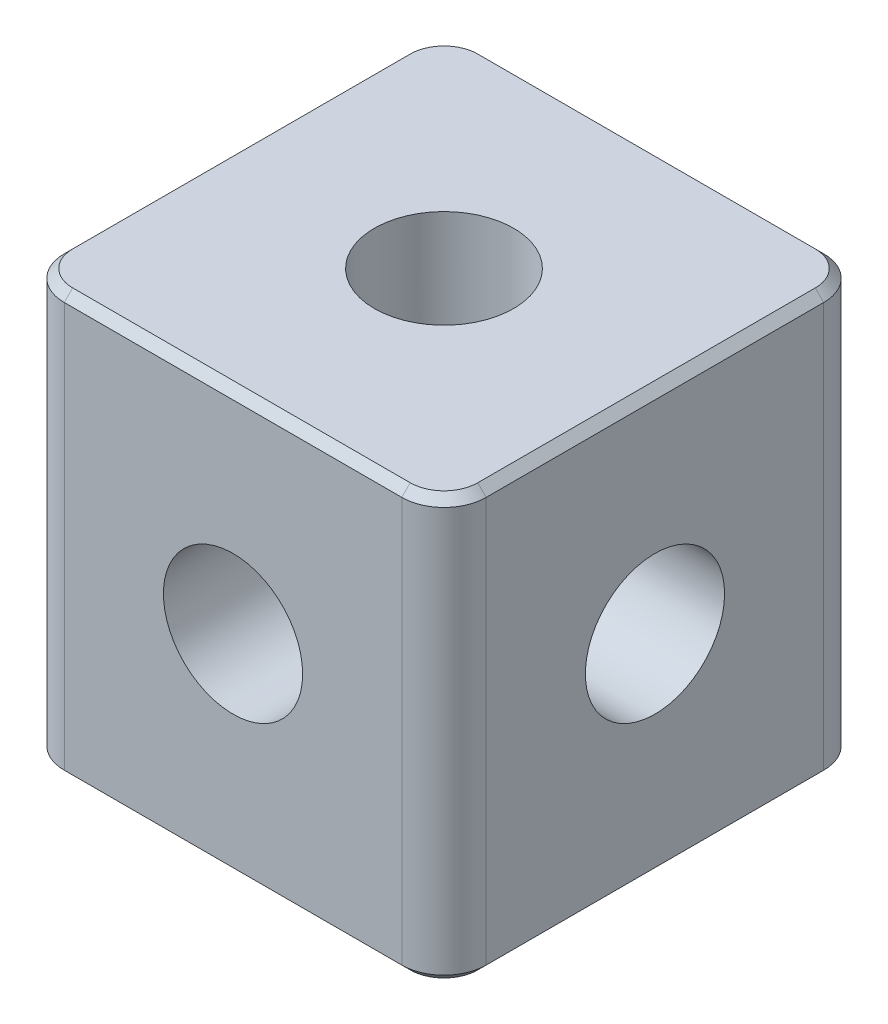
ISO-10303-21;
HEADER;
FILE_DESCRIPTION(('STEP AP214'),'2;1');
FILE_NAME('part.step','',(''),(''),'','','');
FILE_SCHEMA(('AUTOMOTIVE_DESIGN { 1 0 10303 214 1 1 1 1 }'));
ENDSEC;
DATA;
#1=APPLICATION_CONTEXT('core data for automotive mechanical design processes');
#2=APPLICATION_PROTOCOL_DEFINITION('international standard','automotive_design',2000,#1);
#3=PRODUCT_CONTEXT('',#1,'mechanical');
#4=PRODUCT('Part','Part','',(#3));
#5=PRODUCT_RELATED_PRODUCT_CATEGORY('part','',(#4));
#6=PRODUCT_DEFINITION_FORMATION('','',#4);
#7=PRODUCT_DEFINITION_CONTEXT('part definition',#1,'design');
#8=PRODUCT_DEFINITION('design','',#6,#7);
#9=PRODUCT_DEFINITION_SHAPE('','',#8);
#10=(LENGTH_UNIT() NAMED_UNIT(*) SI_UNIT(.MILLI.,.METRE.));
#11=(NAMED_UNIT(*) PLANE_ANGLE_UNIT() SI_UNIT($,.RADIAN.));
#12=(NAMED_UNIT(*) SI_UNIT($,.STERADIAN.) SOLID_ANGLE_UNIT());
#13=UNCERTAINTY_MEASURE_WITH_UNIT(LENGTH_MEASURE(1.E-05),#10,'distance_accuracy_value','');
#14=(GEOMETRIC_REPRESENTATION_CONTEXT(3) GLOBAL_UNCERTAINTY_ASSIGNED_CONTEXT((#13)) GLOBAL_UNIT_ASSIGNED_CONTEXT((#10,
#11,#12)) REPRESENTATION_CONTEXT('',''));
#15=CARTESIAN_POINT('',(0.,0.,0.));
#16=DIRECTION('',(0.,0.,1.));
#17=DIRECTION('',(1.,0.,0.));
#18=AXIS2_PLACEMENT_3D('',#15,#16,#17);
#19=CARTESIAN_POINT('',(0.,5.,0.));
#20=DIRECTION('',(0.,1.,0.));
#21=DIRECTION('',(0.,0.,1.));
#22=AXIS2_PLACEMENT_3D('',#19,#20,#21);
#23=CYLINDRICAL_SURFACE('',#22,1.65);
#24=CARTESIAN_POINT('',(0.,5.,0.));
#25=DIRECTION('',(0.,1.,0.));
#26=DIRECTION('',(0.,0.,1.));
#27=AXIS2_PLACEMENT_3D('',#24,#25,#26);
#28=CIRCLE('',#27,1.65);
#29=CARTESIAN_POINT('',(0.,5.,1.65));
#30=VERTEX_POINT('',#29);
#31=EDGE_CURVE('E491',#30,#30,#28,.T.);
#32=ORIENTED_EDGE('',*,*,#31,.T.);
#33=EDGE_LOOP('',(#32));
#34=FACE_BOUND('',#33,.T.);
#35=CARTESIAN_POINT('',(0.,0.,0.));
#36=DIRECTION('',(0.,0.707106781186547,-0.707106781186547));
#37=DIRECTION('',(0.,0.707106781186547,0.707106781186547));
#38=AXIS2_PLACEMENT_3D('',#35,#36,#37);
#39=ELLIPSE('',#38,2.3334523779156,1.65);
#40=CARTESIAN_POINT('',(1.1667261889578,1.1667261889578,1.1667261889578));
#41=VERTEX_POINT('',#40);
#42=CARTESIAN_POINT('',(-1.1667261889578,1.1667261889578,1.1667261889578));
#43=VERTEX_POINT('',#42);
#44=EDGE_CURVE('E212',#41,#43,#39,.F.);
#45=ORIENTED_EDGE('',*,*,#44,.T.);
#46=CARTESIAN_POINT('',(0.,0.,0.));
#47=DIRECTION('',(0.707106781186547,0.707106781186547,0.));
#48=DIRECTION('',(-0.707106781186547,0.707106781186547,0.));
#49=AXIS2_PLACEMENT_3D('',#46,#47,#48);
#50=ELLIPSE('',#49,2.3334523779156,1.65);
#51=CARTESIAN_POINT('',(-1.1667261889578,1.1667261889578,-1.1667261889578));
#52=VERTEX_POINT('',#51);
#53=EDGE_CURVE('E517',#43,#52,#50,.F.);
#54=ORIENTED_EDGE('',*,*,#53,.T.);
#55=CARTESIAN_POINT('',(0.,0.,0.));
#56=DIRECTION('',(0.,0.707106781186547,0.707106781186547));
#57=DIRECTION('',(0.,0.707106781186547,-0.707106781186547));
#58=AXIS2_PLACEMENT_3D('',#55,#56,#57);
#59=ELLIPSE('',#58,2.3334523779156,1.65);
#60=CARTESIAN_POINT('',(1.1667261889578,1.1667261889578,-1.1667261889578));
#61=VERTEX_POINT('',#60);
#62=EDGE_CURVE('E195',#52,#61,#59,.F.);
#63=ORIENTED_EDGE('',*,*,#62,.T.);
#64=CARTESIAN_POINT('',(0.,0.,0.));
#65=DIRECTION('',(-0.707106781186547,0.707106781186547,0.));
#66=DIRECTION('',(0.707106781186547,0.707106781186547,0.));
#67=AXIS2_PLACEMENT_3D('',#64,#65,#66);
#68=ELLIPSE('',#67,2.3334523779156,1.65);
#69=EDGE_CURVE('E506',#61,#41,#68,.F.);
#70=ORIENTED_EDGE('',*,*,#69,.T.);
#71=EDGE_LOOP('',(#45,#54,#63,#70));
#72=FACE_BOUND('',#71,.T.);
#73=ADVANCED_FACE('F41',(#34,#72),#23,.F.);
#74=CARTESIAN_POINT('',(5.,5.,5.));
#75=DIRECTION('',(-1.,0.,0.));
#76=DIRECTION('',(0.,0.,1.));
#77=AXIS2_PLACEMENT_3D('',#74,#75,#76);
#78=PLANE('',#77);
#79=CARTESIAN_POINT('',(5.,0.,0.));
#80=DIRECTION('',(1.,0.,0.));
#81=DIRECTION('',(0.,0.,-1.));
#82=AXIS2_PLACEMENT_3D('',#79,#80,#81);
#83=CIRCLE('',#82,1.65);
#84=CARTESIAN_POINT('',(5.,0.,-1.65));
#85=VERTEX_POINT('',#84);
#86=EDGE_CURVE('E382',#85,#85,#83,.T.);
#87=ORIENTED_EDGE('',*,*,#86,.F.);
#88=EDGE_LOOP('',(#87));
#89=FACE_BOUND('',#88,.T.);
#90=DIRECTION('',(0.,-1.,0.));
#91=VECTOR('',#90,1.);
#92=CARTESIAN_POINT('',(5.,5.,4.));
#93=LINE('',#92,#91);
#94=CARTESIAN_POINT('',(5.,4.8,4.));
#95=VERTEX_POINT('',#94);
#96=CARTESIAN_POINT('',(5.,-4.8,4.));
#97=VERTEX_POINT('',#96);
#98=EDGE_CURVE('E234',#95,#97,#93,.T.);
#99=ORIENTED_EDGE('',*,*,#98,.T.);
#100=DIRECTION('',(0.,0.,-1.));
#101=VECTOR('',#100,1.);
#102=CARTESIAN_POINT('',(5.,-4.8,-4.));
#103=LINE('',#102,#101);
#104=CARTESIAN_POINT('',(5.,-4.8,-4.));
#105=VERTEX_POINT('',#104);
#106=EDGE_CURVE('E262',#97,#105,#103,.T.);
#107=ORIENTED_EDGE('',*,*,#106,.T.);
#108=DIRECTION('',(0.,-1.,0.));
#109=VECTOR('',#108,1.);
#110=CARTESIAN_POINT('',(5.,5.,-4.));
#111=LINE('',#110,#109);
#112=CARTESIAN_POINT('',(5.,4.8,-4.));
#113=VERTEX_POINT('',#112);
#114=EDGE_CURVE('E238',#105,#113,#111,.F.);
#115=ORIENTED_EDGE('',*,*,#114,.T.);
#116=DIRECTION('',(0.,0.,1.));
#117=VECTOR('',#116,1.);
#118=CARTESIAN_POINT('',(5.,4.8,5.));
#119=LINE('',#118,#117);
#120=EDGE_CURVE('E258',#113,#95,#119,.T.);
#121=ORIENTED_EDGE('',*,*,#120,.T.);
#122=EDGE_LOOP('',(#99,#107,#115,#121));
#123=FACE_BOUND('',#122,.T.);
#124=ADVANCED_FACE('F476',(#89,#123),#78,.F.);
#125=CARTESIAN_POINT('',(-5.,5.,-5.));
#126=DIRECTION('',(0.,0.,1.));
#127=DIRECTION('',(1.,0.,0.));
#128=AXIS2_PLACEMENT_3D('',#125,#126,#127);
#129=PLANE('',#128);
#130=CARTESIAN_POINT('',(0.,0.,-5.));
#131=DIRECTION('',(0.,0.,1.));
#132=DIRECTION('',(1.,0.,0.));
#133=AXIS2_PLACEMENT_3D('',#130,#131,#132);
#134=CIRCLE('',#133,1.65);
#135=CARTESIAN_POINT('',(1.65,0.,-5.));
#136=VERTEX_POINT('',#135);
#137=EDGE_CURVE('E494',#136,#136,#134,.T.);
#138=ORIENTED_EDGE('',*,*,#137,.T.);
#139=EDGE_LOOP('',(#138));
#140=FACE_BOUND('',#139,.T.);
#141=DIRECTION('',(0.,-1.,0.));
#142=VECTOR('',#141,1.);
#143=CARTESIAN_POINT('',(4.,5.,-5.));
#144=LINE('',#143,#142);
#145=CARTESIAN_POINT('',(4.,4.8,-5.));
#146=VERTEX_POINT('',#145);
#147=CARTESIAN_POINT('',(4.,-4.8,-5.));
#148=VERTEX_POINT('',#147);
#149=EDGE_CURVE('E230',#146,#148,#144,.T.);
#150=ORIENTED_EDGE('',*,*,#149,.T.);
#151=DIRECTION('',(-1.,0.,0.));
#152=VECTOR('',#151,1.);
#153=CARTESIAN_POINT('',(-4.,-4.8,-5.));
#154=LINE('',#153,#152);
#155=CARTESIAN_POINT('',(-4.,-4.8,-5.));
#156=VERTEX_POINT('',#155);
#157=EDGE_CURVE('E306',#148,#156,#154,.T.);
#158=ORIENTED_EDGE('',*,*,#157,.T.);
#159=DIRECTION('',(0.,-1.,0.));
#160=VECTOR('',#159,1.);
#161=CARTESIAN_POINT('',(-4.,5.,-5.));
#162=LINE('',#161,#160);
#163=CARTESIAN_POINT('',(-4.,4.8,-5.));
#164=VERTEX_POINT('',#163);
#165=EDGE_CURVE('E226',#156,#164,#162,.F.);
#166=ORIENTED_EDGE('',*,*,#165,.T.);
#167=DIRECTION('',(1.,0.,0.));
#168=VECTOR('',#167,1.);
#169=CARTESIAN_POINT('',(-5.,4.8,-5.));
#170=LINE('',#169,#168);
#171=EDGE_CURVE('E303',#164,#146,#170,.T.);
#172=ORIENTED_EDGE('',*,*,#171,.T.);
#173=EDGE_LOOP('',(#150,#158,#166,#172));
#174=FACE_BOUND('',#173,.T.);
#175=ADVANCED_FACE('F533',(#140,#174),#129,.F.);
#176=CARTESIAN_POINT('',(-5.,5.,5.));
#177=DIRECTION('',(1.,0.,0.));
#178=DIRECTION('',(0.,0.,-1.));
#179=AXIS2_PLACEMENT_3D('',#176,#177,#178);
#180=PLANE('',#179);
#181=CARTESIAN_POINT('',(-5.,0.,0.));
#182=DIRECTION('',(1.,0.,0.));
#183=DIRECTION('',(0.,0.,-1.));
#184=AXIS2_PLACEMENT_3D('',#181,#182,#183);
#185=CIRCLE('',#184,1.65);
#186=CARTESIAN_POINT('',(-5.,0.,-1.65));
#187=VERTEX_POINT('',#186);
#188=EDGE_CURVE('E205',#187,#187,#185,.T.);
#189=ORIENTED_EDGE('',*,*,#188,.T.);
#190=EDGE_LOOP('',(#189));
#191=FACE_BOUND('',#190,.T.);
#192=DIRECTION('',(0.,-1.,0.));
#193=VECTOR('',#192,1.);
#194=CARTESIAN_POINT('',(-5.,5.,-4.));
#195=LINE('',#194,#193);
#196=CARTESIAN_POINT('',(-5.,4.8,-4.));
#197=VERTEX_POINT('',#196);
#198=CARTESIAN_POINT('',(-5.,-4.8,-4.));
#199=VERTEX_POINT('',#198);
#200=EDGE_CURVE('E250',#197,#199,#195,.T.);
#201=ORIENTED_EDGE('',*,*,#200,.T.);
#202=DIRECTION('',(0.,0.,1.));
#203=VECTOR('',#202,1.);
#204=CARTESIAN_POINT('',(-5.,-4.8,4.));
#205=LINE('',#204,#203);
#206=CARTESIAN_POINT('',(-5.,-4.8,4.));
#207=VERTEX_POINT('',#206);
#208=EDGE_CURVE('E330',#199,#207,#205,.T.);
#209=ORIENTED_EDGE('',*,*,#208,.T.);
#210=DIRECTION('',(0.,-1.,0.));
#211=VECTOR('',#210,1.);
#212=CARTESIAN_POINT('',(-5.,5.,4.));
#213=LINE('',#212,#211);
#214=CARTESIAN_POINT('',(-5.,4.8,4.));
#215=VERTEX_POINT('',#214);
#216=EDGE_CURVE('E254',#207,#215,#213,.F.);
#217=ORIENTED_EDGE('',*,*,#216,.T.);
#218=DIRECTION('',(0.,0.,-1.));
#219=VECTOR('',#218,1.);
#220=CARTESIAN_POINT('',(-5.,4.8,5.));
#221=LINE('',#220,#219);
#222=EDGE_CURVE('E327',#215,#197,#221,.T.);
#223=ORIENTED_EDGE('',*,*,#222,.T.);
#224=EDGE_LOOP('',(#201,#209,#217,#223));
#225=FACE_BOUND('',#224,.T.);
#226=ADVANCED_FACE('F423',(#191,#225),#180,.F.);
#227=CARTESIAN_POINT('',(-5.,5.,5.));
#228=DIRECTION('',(0.,0.,-1.));
#229=DIRECTION('',(-1.,0.,0.));
#230=AXIS2_PLACEMENT_3D('',#227,#228,#229);
#231=PLANE('',#230);
#232=CARTESIAN_POINT('',(0.,0.,5.));
#233=DIRECTION('',(0.,0.,1.));
#234=DIRECTION('',(1.,0.,0.));
#235=AXIS2_PLACEMENT_3D('',#232,#233,#234);
#236=CIRCLE('',#235,1.65);
#237=CARTESIAN_POINT('',(1.65,0.,5.));
#238=VERTEX_POINT('',#237);
#239=EDGE_CURVE('E500',#238,#238,#236,.T.);
#240=ORIENTED_EDGE('',*,*,#239,.F.);
#241=EDGE_LOOP('',(#240));
#242=FACE_BOUND('',#241,.T.);
#243=DIRECTION('',(0.,-1.,0.));
#244=VECTOR('',#243,1.);
#245=CARTESIAN_POINT('',(-4.,5.,5.));
#246=LINE('',#245,#244);
#247=CARTESIAN_POINT('',(-4.,4.8,5.));
#248=VERTEX_POINT('',#247);
#249=CARTESIAN_POINT('',(-4.,-4.8,5.));
#250=VERTEX_POINT('',#249);
#251=EDGE_CURVE('E242',#248,#250,#246,.T.);
#252=ORIENTED_EDGE('',*,*,#251,.T.);
#253=DIRECTION('',(1.,0.,0.));
#254=VECTOR('',#253,1.);
#255=CARTESIAN_POINT('',(4.,-4.8,5.));
#256=LINE('',#255,#254);
#257=CARTESIAN_POINT('',(4.,-4.8,5.));
#258=VERTEX_POINT('',#257);
#259=EDGE_CURVE('E312',#250,#258,#256,.T.);
#260=ORIENTED_EDGE('',*,*,#259,.T.);
#261=DIRECTION('',(0.,-1.,0.));
#262=VECTOR('',#261,1.);
#263=CARTESIAN_POINT('',(4.,5.,5.));
#264=LINE('',#263,#262);
#265=CARTESIAN_POINT('',(4.,4.8,5.));
#266=VERTEX_POINT('',#265);
#267=EDGE_CURVE('E246',#258,#266,#264,.F.);
#268=ORIENTED_EDGE('',*,*,#267,.T.);
#269=DIRECTION('',(-1.,0.,0.));
#270=VECTOR('',#269,1.);
#271=CARTESIAN_POINT('',(-5.,4.8,5.));
#272=LINE('',#271,#270);
#273=EDGE_CURVE('E309',#266,#248,#272,.T.);
#274=ORIENTED_EDGE('',*,*,#273,.T.);
#275=EDGE_LOOP('',(#252,#260,#268,#274));
#276=FACE_BOUND('',#275,.T.);
#277=ADVANCED_FACE('F456',(#242,#276),#231,.F.);
#278=CARTESIAN_POINT('',(0.,5.,0.));
#279=DIRECTION('',(0.,-1.,0.));
#280=DIRECTION('',(0.,0.,-1.));
#281=AXIS2_PLACEMENT_3D('',#278,#279,#280);
#282=PLANE('',#281);
#283=CARTESIAN_POINT('',(4.,5.,4.));
#284=DIRECTION('',(0.,-1.,0.));
#285=DIRECTION('',(0.,0.,-1.));
#286=AXIS2_PLACEMENT_3D('',#283,#284,#285);
#287=CIRCLE('',#286,0.800000000000001);
#288=CARTESIAN_POINT('',(4.,5.,4.8));
#289=VERTEX_POINT('',#288);
#290=CARTESIAN_POINT('',(4.8,5.,4.));
#291=VERTEX_POINT('',#290);
#292=EDGE_CURVE('E66',#289,#291,#287,.F.);
#293=ORIENTED_EDGE('',*,*,#292,.T.);
#294=DIRECTION('',(0.,0.,-1.));
#295=VECTOR('',#294,1.);
#296=CARTESIAN_POINT('',(4.8,5.,0.));
#297=LINE('',#296,#295);
#298=CARTESIAN_POINT('',(4.8,5.,-4.));
#299=VERTEX_POINT('',#298);
#300=EDGE_CURVE('E11',#291,#299,#297,.T.);
#301=ORIENTED_EDGE('',*,*,#300,.T.);
#302=CARTESIAN_POINT('',(4.,5.,-4.));
#303=DIRECTION('',(0.,-1.,0.));
#304=DIRECTION('',(0.,0.,-1.));
#305=AXIS2_PLACEMENT_3D('',#302,#303,#304);
#306=CIRCLE('',#305,0.800000000000001);
#307=CARTESIAN_POINT('',(4.,5.,-4.8));
#308=VERTEX_POINT('',#307);
#309=EDGE_CURVE('E51',#299,#308,#306,.F.);
#310=ORIENTED_EDGE('',*,*,#309,.T.);
#311=DIRECTION('',(-1.,0.,0.));
#312=VECTOR('',#311,1.);
#313=CARTESIAN_POINT('',(0.,5.,-4.8));
#314=LINE('',#313,#312);
#315=CARTESIAN_POINT('',(-4.,5.,-4.8));
#316=VERTEX_POINT('',#315);
#317=EDGE_CURVE('E345',#308,#316,#314,.T.);
#318=ORIENTED_EDGE('',*,*,#317,.T.);
#319=CARTESIAN_POINT('',(-4.,5.,-4.));
#320=DIRECTION('',(0.,-1.,0.));
#321=DIRECTION('',(0.,0.,-1.));
#322=AXIS2_PLACEMENT_3D('',#319,#320,#321);
#323=CIRCLE('',#322,0.800000000000001);
#324=CARTESIAN_POINT('',(-4.8,5.,-4.));
#325=VERTEX_POINT('',#324);
#326=EDGE_CURVE('E339',#316,#325,#323,.F.);
#327=ORIENTED_EDGE('',*,*,#326,.T.);
#328=DIRECTION('',(0.,0.,1.));
#329=VECTOR('',#328,1.);
#330=CARTESIAN_POINT('',(-4.8,5.,0.));
#331=LINE('',#330,#329);
#332=CARTESIAN_POINT('',(-4.8,5.,4.));
#333=VERTEX_POINT('',#332);
#334=EDGE_CURVE('E333',#325,#333,#331,.T.);
#335=ORIENTED_EDGE('',*,*,#334,.T.);
#336=CARTESIAN_POINT('',(-4.,5.,4.));
#337=DIRECTION('',(0.,-1.,0.));
#338=DIRECTION('',(0.,0.,-1.));
#339=AXIS2_PLACEMENT_3D('',#336,#337,#338);
#340=CIRCLE('',#339,0.800000000000001);
#341=CARTESIAN_POINT('',(-4.,5.,4.8));
#342=VERTEX_POINT('',#341);
#343=EDGE_CURVE('E336',#333,#342,#340,.F.);
#344=ORIENTED_EDGE('',*,*,#343,.T.);
#345=DIRECTION('',(1.,0.,0.));
#346=VECTOR('',#345,1.);
#347=CARTESIAN_POINT('',(0.,5.,4.8));
#348=LINE('',#347,#346);
#349=EDGE_CURVE('E342',#342,#289,#348,.T.);
#350=ORIENTED_EDGE('',*,*,#349,.T.);
#351=EDGE_LOOP('',(#293,#301,#310,#318,#327,#335,#344,#350));
#352=FACE_BOUND('',#351,.T.);
#353=ORIENTED_EDGE('',*,*,#31,.F.);
#354=EDGE_LOOP('',(#353));
#355=FACE_BOUND('',#354,.T.);
#356=ADVANCED_FACE('F485',(#352,#355),#282,.F.);
#357=CARTESIAN_POINT('',(0.,-5.,0.));
#358=DIRECTION('',(0.,-1.,0.));
#359=DIRECTION('',(0.,0.,-1.));
#360=AXIS2_PLACEMENT_3D('',#357,#358,#359);
#361=PLANE('',#360);
#362=CARTESIAN_POINT('',(4.,-5.,-4.));
#363=DIRECTION('',(0.,-1.,0.));
#364=DIRECTION('',(0.,0.,-1.));
#365=AXIS2_PLACEMENT_3D('',#362,#363,#364);
#366=CIRCLE('',#365,0.800000000000001);
#367=CARTESIAN_POINT('',(4.,-5.,-4.8));
#368=VERTEX_POINT('',#367);
#369=CARTESIAN_POINT('',(4.8,-5.,-4.));
#370=VERTEX_POINT('',#369);
#371=EDGE_CURVE('E284',#368,#370,#366,.T.);
#372=ORIENTED_EDGE('',*,*,#371,.T.);
#373=DIRECTION('',(0.,0.,1.));
#374=VECTOR('',#373,1.);
#375=CARTESIAN_POINT('',(4.8,-5.,4.));
#376=LINE('',#375,#374);
#377=CARTESIAN_POINT('',(4.8,-5.,4.));
#378=VERTEX_POINT('',#377);
#379=EDGE_CURVE('E287',#370,#378,#376,.T.);
#380=ORIENTED_EDGE('',*,*,#379,.T.);
#381=CARTESIAN_POINT('',(4.,-5.,4.));
#382=DIRECTION('',(0.,-1.,0.));
#383=DIRECTION('',(0.,0.,-1.));
#384=AXIS2_PLACEMENT_3D('',#381,#382,#383);
#385=CIRCLE('',#384,0.800000000000001);
#386=CARTESIAN_POINT('',(4.,-5.,4.8));
#387=VERTEX_POINT('',#386);
#388=EDGE_CURVE('E281',#378,#387,#385,.T.);
#389=ORIENTED_EDGE('',*,*,#388,.T.);
#390=DIRECTION('',(-1.,0.,0.));
#391=VECTOR('',#390,1.);
#392=CARTESIAN_POINT('',(-4.,-5.,4.8));
#393=LINE('',#392,#391);
#394=CARTESIAN_POINT('',(-4.,-5.,4.8));
#395=VERTEX_POINT('',#394);
#396=EDGE_CURVE('E275',#387,#395,#393,.T.);
#397=ORIENTED_EDGE('',*,*,#396,.T.);
#398=CARTESIAN_POINT('',(-4.,-5.,4.));
#399=DIRECTION('',(0.,-1.,0.));
#400=DIRECTION('',(0.,0.,-1.));
#401=AXIS2_PLACEMENT_3D('',#398,#399,#400);
#402=CIRCLE('',#401,0.800000000000001);
#403=CARTESIAN_POINT('',(-4.8,-5.,4.));
#404=VERTEX_POINT('',#403);
#405=EDGE_CURVE('E269',#395,#404,#402,.T.);
#406=ORIENTED_EDGE('',*,*,#405,.T.);
#407=DIRECTION('',(0.,0.,-1.));
#408=VECTOR('',#407,1.);
#409=CARTESIAN_POINT('',(-4.8,-5.,-4.));
#410=LINE('',#409,#408);
#411=CARTESIAN_POINT('',(-4.8,-5.,-4.));
#412=VERTEX_POINT('',#411);
#413=EDGE_CURVE('E266',#404,#412,#410,.T.);
#414=ORIENTED_EDGE('',*,*,#413,.T.);
#415=CARTESIAN_POINT('',(-4.,-5.,-4.));
#416=DIRECTION('',(0.,-1.,0.));
#417=DIRECTION('',(0.,0.,-1.));
#418=AXIS2_PLACEMENT_3D('',#415,#416,#417);
#419=CIRCLE('',#418,0.800000000000001);
#420=CARTESIAN_POINT('',(-4.,-5.,-4.8));
#421=VERTEX_POINT('',#420);
#422=EDGE_CURVE('E272',#412,#421,#419,.T.);
#423=ORIENTED_EDGE('',*,*,#422,.T.);
#424=DIRECTION('',(1.,0.,0.));
#425=VECTOR('',#424,1.);
#426=CARTESIAN_POINT('',(4.,-5.,-4.8));
#427=LINE('',#426,#425);
#428=EDGE_CURVE('E278',#421,#368,#427,.T.);
#429=ORIENTED_EDGE('',*,*,#428,.T.);
#430=EDGE_LOOP('',(#372,#380,#389,#397,#406,#414,#423,#429));
#431=FACE_BOUND('',#430,.T.);
#432=CARTESIAN_POINT('',(0.,-5.,0.));
#433=DIRECTION('',(0.,1.,0.));
#434=DIRECTION('',(0.,0.,1.));
#435=AXIS2_PLACEMENT_3D('',#432,#433,#434);
#436=CIRCLE('',#435,1.65);
#437=CARTESIAN_POINT('',(0.,-5.,1.65));
#438=VERTEX_POINT('',#437);
#439=EDGE_CURVE('E218',#438,#438,#436,.T.);
#440=ORIENTED_EDGE('',*,*,#439,.T.);
#441=EDGE_LOOP('',(#440));
#442=FACE_BOUND('',#441,.T.);
#443=ADVANCED_FACE('F442',(#431,#442),#361,.T.);
#444=CARTESIAN_POINT('',(0.,0.,0.));
#445=DIRECTION('',(0.,0.707106781186547,0.707106781186547));
#446=DIRECTION('',(0.,0.707106781186547,-0.707106781186547));
#447=AXIS2_PLACEMENT_3D('',#444,#445,#446);
#448=ELLIPSE('',#447,2.3334523779156,1.65);
#449=CARTESIAN_POINT('',(-1.1667261889578,-1.1667261889578,1.1667261889578));
#450=VERTEX_POINT('',#449);
#451=CARTESIAN_POINT('',(1.1667261889578,-1.1667261889578,1.1667261889578));
#452=VERTEX_POINT('',#451);
#453=EDGE_CURVE('E211',#450,#452,#448,.T.);
#454=ORIENTED_EDGE('',*,*,#453,.T.);
#455=CARTESIAN_POINT('',(0.,0.,0.));
#456=DIRECTION('',(0.707106781186547,0.707106781186547,0.));
#457=DIRECTION('',(-0.707106781186547,0.707106781186547,0.));
#458=AXIS2_PLACEMENT_3D('',#455,#456,#457);
#459=ELLIPSE('',#458,2.3334523779156,1.65);
#460=CARTESIAN_POINT('',(1.1667261889578,-1.1667261889578,-1.1667261889578));
#461=VERTEX_POINT('',#460);
#462=EDGE_CURVE('E194',#452,#461,#459,.T.);
#463=ORIENTED_EDGE('',*,*,#462,.T.);
#464=CARTESIAN_POINT('',(0.,0.,0.));
#465=DIRECTION('',(0.,0.707106781186547,-0.707106781186547));
#466=DIRECTION('',(0.,0.707106781186547,0.707106781186547));
#467=AXIS2_PLACEMENT_3D('',#464,#465,#466);
#468=ELLIPSE('',#467,2.3334523779156,1.65);
#469=CARTESIAN_POINT('',(-1.1667261889578,-1.1667261889578,-1.1667261889578));
#470=VERTEX_POINT('',#469);
#471=EDGE_CURVE('E202',#461,#470,#468,.T.);
#472=ORIENTED_EDGE('',*,*,#471,.T.);
#473=CARTESIAN_POINT('',(0.,0.,0.));
#474=DIRECTION('',(-0.707106781186547,0.707106781186547,0.));
#475=DIRECTION('',(0.707106781186547,0.707106781186547,0.));
#476=AXIS2_PLACEMENT_3D('',#473,#474,#475);
#477=ELLIPSE('',#476,2.3334523779156,1.65);
#478=EDGE_CURVE('E182',#470,#450,#477,.T.);
#479=ORIENTED_EDGE('',*,*,#478,.T.);
#480=EDGE_LOOP('',(#454,#463,#472,#479));
#481=FACE_BOUND('',#480,.T.);
#482=ORIENTED_EDGE('',*,*,#439,.F.);
#483=EDGE_LOOP('',(#482));
#484=FACE_BOUND('',#483,.T.);
#485=ADVANCED_FACE('F208',(#481,#484),#23,.F.);
#486=CARTESIAN_POINT('',(0.,0.,5.));
#487=DIRECTION('',(0.,0.,1.));
#488=DIRECTION('',(1.,0.,0.));
#489=AXIS2_PLACEMENT_3D('',#486,#487,#488);
#490=CYLINDRICAL_SURFACE('',#489,1.65);
#491=ORIENTED_EDGE('',*,*,#239,.T.);
#492=EDGE_LOOP('',(#491));
#493=FACE_BOUND('',#492,.T.);
#494=ORIENTED_EDGE('',*,*,#453,.F.);
#495=CARTESIAN_POINT('',(0.,0.,0.));
#496=DIRECTION('',(0.707106781186547,0.,0.707106781186547));
#497=DIRECTION('',(-0.707106781186547,0.,0.707106781186547));
#498=AXIS2_PLACEMENT_3D('',#495,#496,#497);
#499=ELLIPSE('',#498,2.3334523779156,1.65);
#500=EDGE_CURVE('E188',#450,#43,#499,.F.);
#501=ORIENTED_EDGE('',*,*,#500,.T.);
#502=ORIENTED_EDGE('',*,*,#44,.F.);
#503=CARTESIAN_POINT('',(0.,0.,0.));
#504=DIRECTION('',(-0.707106781186547,0.,0.707106781186547));
#505=DIRECTION('',(0.707106781186547,0.,0.707106781186547));
#506=AXIS2_PLACEMENT_3D('',#503,#504,#505);
#507=ELLIPSE('',#506,2.3334523779156,1.65);
#508=EDGE_CURVE('E513',#41,#452,#507,.F.);
#509=ORIENTED_EDGE('',*,*,#508,.T.);
#510=EDGE_LOOP('',(#494,#501,#502,#509));
#511=FACE_BOUND('',#510,.T.);
#512=ADVANCED_FACE('F666',(#493,#511),#490,.F.);
#513=ORIENTED_EDGE('',*,*,#137,.F.);
#514=EDGE_LOOP('',(#513));
#515=FACE_BOUND('',#514,.T.);
#516=ORIENTED_EDGE('',*,*,#471,.F.);
#517=CARTESIAN_POINT('',(0.,0.,0.));
#518=DIRECTION('',(0.707106781186547,0.,0.707106781186547));
#519=DIRECTION('',(-0.707106781186547,0.,0.707106781186547));
#520=AXIS2_PLACEMENT_3D('',#517,#518,#519);
#521=ELLIPSE('',#520,2.3334523779156,1.65);
#522=EDGE_CURVE('E510',#461,#61,#521,.T.);
#523=ORIENTED_EDGE('',*,*,#522,.T.);
#524=ORIENTED_EDGE('',*,*,#62,.F.);
#525=CARTESIAN_POINT('',(0.,0.,0.));
#526=DIRECTION('',(-0.707106781186547,0.,0.707106781186547));
#527=DIRECTION('',(0.707106781186547,0.,0.707106781186547));
#528=AXIS2_PLACEMENT_3D('',#525,#526,#527);
#529=ELLIPSE('',#528,2.3334523779156,1.65);
#530=EDGE_CURVE('E185',#52,#470,#529,.T.);
#531=ORIENTED_EDGE('',*,*,#530,.T.);
#532=EDGE_LOOP('',(#516,#523,#524,#531));
#533=FACE_BOUND('',#532,.T.);
#534=ADVANCED_FACE('F200',(#515,#533),#490,.F.);
#535=CARTESIAN_POINT('',(5.,0.,0.));
#536=DIRECTION('',(1.,0.,0.));
#537=DIRECTION('',(0.,0.,-1.));
#538=AXIS2_PLACEMENT_3D('',#535,#536,#537);
#539=CYLINDRICAL_SURFACE('',#538,1.65);
#540=ORIENTED_EDGE('',*,*,#188,.F.);
#541=EDGE_LOOP('',(#540));
#542=FACE_BOUND('',#541,.T.);
#543=ORIENTED_EDGE('',*,*,#500,.F.);
#544=ORIENTED_EDGE('',*,*,#478,.F.);
#545=ORIENTED_EDGE('',*,*,#530,.F.);
#546=ORIENTED_EDGE('',*,*,#53,.F.);
#547=EDGE_LOOP('',(#543,#544,#545,#546));
#548=FACE_BOUND('',#547,.T.);
#549=ADVANCED_FACE('F184',(#542,#548),#539,.F.);
#550=ORIENTED_EDGE('',*,*,#86,.T.);
#551=EDGE_LOOP('',(#550));
#552=FACE_BOUND('',#551,.T.);
#553=ORIENTED_EDGE('',*,*,#522,.F.);
#554=ORIENTED_EDGE('',*,*,#462,.F.);
#555=ORIENTED_EDGE('',*,*,#508,.F.);
#556=ORIENTED_EDGE('',*,*,#69,.F.);
#557=EDGE_LOOP('',(#553,#554,#555,#556));
#558=FACE_BOUND('',#557,.T.);
#559=ADVANCED_FACE('F529',(#552,#558),#539,.F.);
#560=CARTESIAN_POINT('',(4.,5.,-4.));
#561=DIRECTION('',(0.,-1.,0.));
#562=DIRECTION('',(0.,0.,-1.));
#563=AXIS2_PLACEMENT_3D('',#560,#561,#562);
#564=CYLINDRICAL_SURFACE('',#563,1.);
#565=ORIENTED_EDGE('',*,*,#114,.F.);
#566=CARTESIAN_POINT('',(4.,-4.8,-4.));
#567=DIRECTION('',(0.,-1.,0.));
#568=DIRECTION('',(0.,0.,-1.));
#569=AXIS2_PLACEMENT_3D('',#566,#567,#568);
#570=CIRCLE('',#569,1.);
#571=EDGE_CURVE('E294',#105,#148,#570,.F.);
#572=ORIENTED_EDGE('',*,*,#571,.T.);
#573=ORIENTED_EDGE('',*,*,#149,.F.);
#574=CARTESIAN_POINT('',(4.,4.8,-4.));
#575=DIRECTION('',(0.,-1.,0.));
#576=DIRECTION('',(0.,0.,-1.));
#577=AXIS2_PLACEMENT_3D('',#574,#575,#576);
#578=CIRCLE('',#577,1.);
#579=EDGE_CURVE('E291',#146,#113,#578,.T.);
#580=ORIENTED_EDGE('',*,*,#579,.T.);
#581=EDGE_LOOP('',(#565,#572,#573,#580));
#582=FACE_BOUND('',#581,.T.);
#583=ADVANCED_FACE('F544',(#582),#564,.T.);
#584=CARTESIAN_POINT('',(4.,5.,4.));
#585=DIRECTION('',(0.,-1.,0.));
#586=DIRECTION('',(0.,0.,-1.));
#587=AXIS2_PLACEMENT_3D('',#584,#585,#586);
#588=CYLINDRICAL_SURFACE('',#587,1.);
#589=ORIENTED_EDGE('',*,*,#267,.F.);
#590=CARTESIAN_POINT('',(4.,-4.8,4.));
#591=DIRECTION('',(0.,-1.,0.));
#592=DIRECTION('',(0.,0.,-1.));
#593=AXIS2_PLACEMENT_3D('',#590,#591,#592);
#594=CIRCLE('',#593,1.);
#595=EDGE_CURVE('E300',#258,#97,#594,.F.);
#596=ORIENTED_EDGE('',*,*,#595,.T.);
#597=ORIENTED_EDGE('',*,*,#98,.F.);
#598=CARTESIAN_POINT('',(4.,4.8,4.));
#599=DIRECTION('',(0.,-1.,0.));
#600=DIRECTION('',(0.,0.,-1.));
#601=AXIS2_PLACEMENT_3D('',#598,#599,#600);
#602=CIRCLE('',#601,1.);
#603=EDGE_CURVE('E297',#95,#266,#602,.T.);
#604=ORIENTED_EDGE('',*,*,#603,.T.);
#605=EDGE_LOOP('',(#589,#596,#597,#604));
#606=FACE_BOUND('',#605,.T.);
#607=ADVANCED_FACE('F474',(#606),#588,.T.);
#608=CARTESIAN_POINT('',(-4.,5.,4.));
#609=DIRECTION('',(0.,-1.,0.));
#610=DIRECTION('',(0.,0.,-1.));
#611=AXIS2_PLACEMENT_3D('',#608,#609,#610);
#612=CYLINDRICAL_SURFACE('',#611,1.);
#613=ORIENTED_EDGE('',*,*,#216,.F.);
#614=CARTESIAN_POINT('',(-4.,-4.8,4.));
#615=DIRECTION('',(0.,-1.,0.));
#616=DIRECTION('',(0.,0.,-1.));
#617=AXIS2_PLACEMENT_3D('',#614,#615,#616);
#618=CIRCLE('',#617,1.);
#619=EDGE_CURVE('E324',#207,#250,#618,.F.);
#620=ORIENTED_EDGE('',*,*,#619,.T.);
#621=ORIENTED_EDGE('',*,*,#251,.F.);
#622=CARTESIAN_POINT('',(-4.,4.8,4.));
#623=DIRECTION('',(0.,-1.,0.));
#624=DIRECTION('',(0.,0.,-1.));
#625=AXIS2_PLACEMENT_3D('',#622,#623,#624);
#626=CIRCLE('',#625,1.);
#627=EDGE_CURVE('E321',#248,#215,#626,.T.);
#628=ORIENTED_EDGE('',*,*,#627,.T.);
#629=EDGE_LOOP('',(#613,#620,#621,#628));
#630=FACE_BOUND('',#629,.T.);
#631=ADVANCED_FACE('F452',(#630),#612,.T.);
#632=CARTESIAN_POINT('',(-4.,5.,-4.));
#633=DIRECTION('',(0.,-1.,0.));
#634=DIRECTION('',(0.,0.,-1.));
#635=AXIS2_PLACEMENT_3D('',#632,#633,#634);
#636=CYLINDRICAL_SURFACE('',#635,1.);
#637=ORIENTED_EDGE('',*,*,#165,.F.);
#638=CARTESIAN_POINT('',(-4.,-4.8,-4.));
#639=DIRECTION('',(0.,-1.,0.));
#640=DIRECTION('',(0.,0.,-1.));
#641=AXIS2_PLACEMENT_3D('',#638,#639,#640);
#642=CIRCLE('',#641,1.);
#643=EDGE_CURVE('E318',#156,#199,#642,.F.);
#644=ORIENTED_EDGE('',*,*,#643,.T.);
#645=ORIENTED_EDGE('',*,*,#200,.F.);
#646=CARTESIAN_POINT('',(-4.,4.8,-4.));
#647=DIRECTION('',(0.,-1.,0.));
#648=DIRECTION('',(0.,0.,-1.));
#649=AXIS2_PLACEMENT_3D('',#646,#647,#648);
#650=CIRCLE('',#649,1.);
#651=EDGE_CURVE('E315',#197,#164,#650,.T.);
#652=ORIENTED_EDGE('',*,*,#651,.T.);
#653=EDGE_LOOP('',(#637,#644,#645,#652));
#654=FACE_BOUND('',#653,.T.);
#655=ADVANCED_FACE('F428',(#654),#636,.T.);
#656=CARTESIAN_POINT('',(-5.,-4.8,5.));
#657=DIRECTION('',(-0.707106781186545,-0.70710678118655,0.));
#658=DIRECTION('',(0.,0.,-1.));
#659=AXIS2_PLACEMENT_3D('',#656,#657,#658);
#660=PLANE('',#659);
#661=DIRECTION('',(-0.707106781186551,0.707106781186544,0.));
#662=VECTOR('',#661,1.);
#663=CARTESIAN_POINT('',(-4.8,-5.,-4.));
#664=LINE('',#663,#662);
#665=EDGE_CURVE('E374',#412,#199,#664,.T.);
#666=ORIENTED_EDGE('',*,*,#665,.F.);
#667=ORIENTED_EDGE('',*,*,#413,.F.);
#668=DIRECTION('',(0.707106781186551,-0.707106781186544,0.));
#669=VECTOR('',#668,1.);
#670=CARTESIAN_POINT('',(-5.,-4.8,4.));
#671=LINE('',#670,#669);
#672=EDGE_CURVE('E378',#207,#404,#671,.T.);
#673=ORIENTED_EDGE('',*,*,#672,.F.);
#674=ORIENTED_EDGE('',*,*,#208,.F.);
#675=EDGE_LOOP('',(#666,#667,#673,#674));
#676=FACE_BOUND('',#675,.T.);
#677=ADVANCED_FACE('F449',(#676),#660,.T.);
#678=CARTESIAN_POINT('',(-4.,-5.,4.));
#679=DIRECTION('',(0.,1.,0.));
#680=DIRECTION('',(0.,0.,1.));
#681=AXIS2_PLACEMENT_3D('',#678,#679,#680);
#682=CONICAL_SURFACE('',#681,0.800000000000001,0.785398163397453);
#683=ORIENTED_EDGE('',*,*,#672,.T.);
#684=ORIENTED_EDGE('',*,*,#405,.F.);
#685=DIRECTION('',(0.,-0.707106781186544,-0.707106781186551));
#686=VECTOR('',#685,1.);
#687=CARTESIAN_POINT('',(-4.,-4.8,5.));
#688=LINE('',#687,#686);
#689=EDGE_CURVE('E370',#250,#395,#688,.T.);
#690=ORIENTED_EDGE('',*,*,#689,.F.);
#691=ORIENTED_EDGE('',*,*,#619,.F.);
#692=EDGE_LOOP('',(#683,#684,#690,#691));
#693=FACE_BOUND('',#692,.T.);
#694=ADVANCED_FACE('F461',(#693),#682,.T.);
#695=CARTESIAN_POINT('',(-4.,-5.,-4.));
#696=DIRECTION('',(0.,1.,0.));
#697=DIRECTION('',(0.,0.,1.));
#698=AXIS2_PLACEMENT_3D('',#695,#696,#697);
#699=CONICAL_SURFACE('',#698,0.800000000000001,0.785398163397453);
#700=ORIENTED_EDGE('',*,*,#665,.T.);
#701=ORIENTED_EDGE('',*,*,#643,.F.);
#702=DIRECTION('',(0.,0.707106781186544,-0.707106781186551));
#703=VECTOR('',#702,1.);
#704=CARTESIAN_POINT('',(-4.,-5.,-4.8));
#705=LINE('',#704,#703);
#706=EDGE_CURVE('E366',#421,#156,#705,.T.);
#707=ORIENTED_EDGE('',*,*,#706,.F.);
#708=ORIENTED_EDGE('',*,*,#422,.F.);
#709=EDGE_LOOP('',(#700,#701,#707,#708));
#710=FACE_BOUND('',#709,.T.);
#711=ADVANCED_FACE('F432',(#710),#699,.T.);
#712=CARTESIAN_POINT('',(-5.,-4.8,5.));
#713=DIRECTION('',(0.,-0.707106781186551,0.707106781186544));
#714=DIRECTION('',(-1.,0.,0.));
#715=AXIS2_PLACEMENT_3D('',#712,#713,#714);
#716=PLANE('',#715);
#717=ORIENTED_EDGE('',*,*,#689,.T.);
#718=ORIENTED_EDGE('',*,*,#396,.F.);
#719=DIRECTION('',(0.,-0.707106781186544,-0.707106781186551));
#720=VECTOR('',#719,1.);
#721=CARTESIAN_POINT('',(4.,-4.8,5.));
#722=LINE('',#721,#720);
#723=EDGE_CURVE('E362',#258,#387,#722,.T.);
#724=ORIENTED_EDGE('',*,*,#723,.F.);
#725=ORIENTED_EDGE('',*,*,#259,.F.);
#726=EDGE_LOOP('',(#717,#718,#724,#725));
#727=FACE_BOUND('',#726,.T.);
#728=ADVANCED_FACE('F465',(#727),#716,.T.);
#729=CARTESIAN_POINT('',(-5.,-4.8,-5.));
#730=DIRECTION('',(0.,-0.707106781186551,-0.707106781186544));
#731=DIRECTION('',(1.,0.,0.));
#732=AXIS2_PLACEMENT_3D('',#729,#730,#731);
#733=PLANE('',#732);
#734=ORIENTED_EDGE('',*,*,#706,.T.);
#735=ORIENTED_EDGE('',*,*,#157,.F.);
#736=DIRECTION('',(0.,0.707106781186544,-0.707106781186551));
#737=VECTOR('',#736,1.);
#738=CARTESIAN_POINT('',(4.,-5.,-4.8));
#739=LINE('',#738,#737);
#740=EDGE_CURVE('E358',#368,#148,#739,.T.);
#741=ORIENTED_EDGE('',*,*,#740,.F.);
#742=ORIENTED_EDGE('',*,*,#428,.F.);
#743=EDGE_LOOP('',(#734,#735,#741,#742));
#744=FACE_BOUND('',#743,.T.);
#745=ADVANCED_FACE('F438',(#744),#733,.T.);
#746=CARTESIAN_POINT('',(4.,-5.,4.));
#747=DIRECTION('',(0.,1.,0.));
#748=DIRECTION('',(0.,0.,1.));
#749=AXIS2_PLACEMENT_3D('',#746,#747,#748);
#750=CONICAL_SURFACE('',#749,0.800000000000001,0.785398163397453);
#751=ORIENTED_EDGE('',*,*,#723,.T.);
#752=ORIENTED_EDGE('',*,*,#388,.F.);
#753=DIRECTION('',(-0.707106781186551,-0.707106781186544,0.));
#754=VECTOR('',#753,1.);
#755=CARTESIAN_POINT('',(5.,-4.8,4.));
#756=LINE('',#755,#754);
#757=EDGE_CURVE('E355',#97,#378,#756,.T.);
#758=ORIENTED_EDGE('',*,*,#757,.F.);
#759=ORIENTED_EDGE('',*,*,#595,.F.);
#760=EDGE_LOOP('',(#751,#752,#758,#759));
#761=FACE_BOUND('',#760,.T.);
#762=ADVANCED_FACE('F470',(#761),#750,.T.);
#763=CARTESIAN_POINT('',(4.,-5.,-4.));
#764=DIRECTION('',(0.,1.,0.));
#765=DIRECTION('',(0.,0.,1.));
#766=AXIS2_PLACEMENT_3D('',#763,#764,#765);
#767=CONICAL_SURFACE('',#766,0.800000000000001,0.785398163397453);
#768=ORIENTED_EDGE('',*,*,#740,.T.);
#769=ORIENTED_EDGE('',*,*,#571,.F.);
#770=DIRECTION('',(0.707106781186551,0.707106781186544,0.));
#771=VECTOR('',#770,1.);
#772=CARTESIAN_POINT('',(4.8,-5.,-4.));
#773=LINE('',#772,#771);
#774=EDGE_CURVE('E352',#370,#105,#773,.T.);
#775=ORIENTED_EDGE('',*,*,#774,.F.);
#776=ORIENTED_EDGE('',*,*,#371,.F.);
#777=EDGE_LOOP('',(#768,#769,#775,#776));
#778=FACE_BOUND('',#777,.T.);
#779=ADVANCED_FACE('F557',(#778),#767,.T.);
#780=CARTESIAN_POINT('',(5.,-4.8,5.));
#781=DIRECTION('',(0.707106781186544,-0.707106781186551,0.));
#782=DIRECTION('',(0.,0.,1.));
#783=AXIS2_PLACEMENT_3D('',#780,#781,#782);
#784=PLANE('',#783);
#785=ORIENTED_EDGE('',*,*,#757,.T.);
#786=ORIENTED_EDGE('',*,*,#379,.F.);
#787=ORIENTED_EDGE('',*,*,#774,.T.);
#788=ORIENTED_EDGE('',*,*,#106,.F.);
#789=EDGE_LOOP('',(#785,#786,#787,#788));
#790=FACE_BOUND('',#789,.T.);
#791=ADVANCED_FACE('F554',(#790),#784,.T.);
#792=CARTESIAN_POINT('',(-4.8,5.,0.));
#793=DIRECTION('',(0.707106781186554,-0.707106781186541,0.));
#794=DIRECTION('',(0.,0.,1.));
#795=AXIS2_PLACEMENT_3D('',#792,#793,#794);
#796=PLANE('',#795);
#797=DIRECTION('',(0.70710678118654,0.707106781186555,0.));
#798=VECTOR('',#797,1.);
#799=CARTESIAN_POINT('',(-5.,4.8,-4.));
#800=LINE('',#799,#798);
#801=EDGE_CURVE('E403',#197,#325,#800,.T.);
#802=ORIENTED_EDGE('',*,*,#801,.F.);
#803=ORIENTED_EDGE('',*,*,#222,.F.);
#804=DIRECTION('',(-0.70710678118654,-0.707106781186555,0.));
#805=VECTOR('',#804,1.);
#806=CARTESIAN_POINT('',(-4.8,5.,4.));
#807=LINE('',#806,#805);
#808=EDGE_CURVE('E45',#333,#215,#807,.T.);
#809=ORIENTED_EDGE('',*,*,#808,.F.);
#810=ORIENTED_EDGE('',*,*,#334,.F.);
#811=EDGE_LOOP('',(#802,#803,#809,#810));
#812=FACE_BOUND('',#811,.T.);
#813=ADVANCED_FACE('F43',(#812),#796,.F.);
#814=CARTESIAN_POINT('',(-4.,5.,4.));
#815=DIRECTION('',(0.,-1.,0.));
#816=DIRECTION('',(0.,0.,-1.));
#817=AXIS2_PLACEMENT_3D('',#814,#815,#816);
#818=CONICAL_SURFACE('',#817,0.800000000000001,0.78539816339744);
#819=ORIENTED_EDGE('',*,*,#808,.T.);
#820=ORIENTED_EDGE('',*,*,#627,.F.);
#821=DIRECTION('',(0.,-0.707106781186554,0.707106781186541));
#822=VECTOR('',#821,1.);
#823=CARTESIAN_POINT('',(-4.,5.,4.8));
#824=LINE('',#823,#822);
#825=EDGE_CURVE('E400',#342,#248,#824,.T.);
#826=ORIENTED_EDGE('',*,*,#825,.F.);
#827=ORIENTED_EDGE('',*,*,#343,.F.);
#828=EDGE_LOOP('',(#819,#820,#826,#827));
#829=FACE_BOUND('',#828,.T.);
#830=ADVANCED_FACE('F416',(#829),#818,.T.);
#831=CARTESIAN_POINT('',(-4.,5.,-4.));
#832=DIRECTION('',(0.,-1.,0.));
#833=DIRECTION('',(0.,0.,-1.));
#834=AXIS2_PLACEMENT_3D('',#831,#832,#833);
#835=CONICAL_SURFACE('',#834,0.800000000000001,0.78539816339744);
#836=ORIENTED_EDGE('',*,*,#801,.T.);
#837=ORIENTED_EDGE('',*,*,#326,.F.);
#838=DIRECTION('',(0.,0.707106781186554,0.707106781186541));
#839=VECTOR('',#838,1.);
#840=CARTESIAN_POINT('',(-4.,4.8,-5.));
#841=LINE('',#840,#839);
#842=EDGE_CURVE('E396',#164,#316,#841,.T.);
#843=ORIENTED_EDGE('',*,*,#842,.F.);
#844=ORIENTED_EDGE('',*,*,#651,.F.);
#845=EDGE_LOOP('',(#836,#837,#843,#844));
#846=FACE_BOUND('',#845,.T.);
#847=ADVANCED_FACE('F589',(#846),#835,.T.);
#848=CARTESIAN_POINT('',(0.,5.,4.8));
#849=DIRECTION('',(0.,-0.707106781186541,-0.707106781186554));
#850=DIRECTION('',(1.,0.,0.));
#851=AXIS2_PLACEMENT_3D('',#848,#849,#850);
#852=PLANE('',#851);
#853=ORIENTED_EDGE('',*,*,#825,.T.);
#854=ORIENTED_EDGE('',*,*,#273,.F.);
#855=DIRECTION('',(0.,-0.707106781186554,0.707106781186541));
#856=VECTOR('',#855,1.);
#857=CARTESIAN_POINT('',(4.,5.,4.8));
#858=LINE('',#857,#856);
#859=EDGE_CURVE('E392',#289,#266,#858,.T.);
#860=ORIENTED_EDGE('',*,*,#859,.F.);
#861=ORIENTED_EDGE('',*,*,#349,.F.);
#862=EDGE_LOOP('',(#853,#854,#860,#861));
#863=FACE_BOUND('',#862,.T.);
#864=ADVANCED_FACE('F585',(#863),#852,.F.);
#865=CARTESIAN_POINT('',(0.,5.,-4.8));
#866=DIRECTION('',(0.,-0.707106781186541,0.707106781186554));
#867=DIRECTION('',(-1.,0.,0.));
#868=AXIS2_PLACEMENT_3D('',#865,#866,#867);
#869=PLANE('',#868);
#870=ORIENTED_EDGE('',*,*,#842,.T.);
#871=ORIENTED_EDGE('',*,*,#317,.F.);
#872=DIRECTION('',(0.,0.707106781186554,0.707106781186541));
#873=VECTOR('',#872,1.);
#874=CARTESIAN_POINT('',(4.,4.8,-5.));
#875=LINE('',#874,#873);
#876=EDGE_CURVE('E388',#146,#308,#875,.T.);
#877=ORIENTED_EDGE('',*,*,#876,.F.);
#878=ORIENTED_EDGE('',*,*,#171,.F.);
#879=EDGE_LOOP('',(#870,#871,#877,#878));
#880=FACE_BOUND('',#879,.T.);
#881=ADVANCED_FACE('F581',(#880),#869,.F.);
#882=CARTESIAN_POINT('',(4.,5.,4.));
#883=DIRECTION('',(0.,-1.,0.));
#884=DIRECTION('',(0.,0.,-1.));
#885=AXIS2_PLACEMENT_3D('',#882,#883,#884);
#886=CONICAL_SURFACE('',#885,0.800000000000001,0.78539816339744);
#887=ORIENTED_EDGE('',*,*,#859,.T.);
#888=ORIENTED_EDGE('',*,*,#603,.F.);
#889=DIRECTION('',(0.707106781186541,-0.707106781186554,0.));
#890=VECTOR('',#889,1.);
#891=CARTESIAN_POINT('',(4.8,5.,4.));
#892=LINE('',#891,#890);
#893=EDGE_CURVE('E385',#291,#95,#892,.T.);
#894=ORIENTED_EDGE('',*,*,#893,.F.);
#895=ORIENTED_EDGE('',*,*,#292,.F.);
#896=EDGE_LOOP('',(#887,#888,#894,#895));
#897=FACE_BOUND('',#896,.T.);
#898=ADVANCED_FACE('F578',(#897),#886,.T.);
#899=CARTESIAN_POINT('',(4.,5.,-4.));
#900=DIRECTION('',(0.,-1.,0.));
#901=DIRECTION('',(0.,0.,-1.));
#902=AXIS2_PLACEMENT_3D('',#899,#900,#901);
#903=CONICAL_SURFACE('',#902,0.800000000000001,0.78539816339744);
#904=ORIENTED_EDGE('',*,*,#876,.T.);
#905=ORIENTED_EDGE('',*,*,#309,.F.);
#906=DIRECTION('',(-0.707106781186541,0.707106781186554,0.));
#907=VECTOR('',#906,1.);
#908=CARTESIAN_POINT('',(5.,4.8,-4.));
#909=LINE('',#908,#907);
#910=EDGE_CURVE('E59',#113,#299,#909,.T.);
#911=ORIENTED_EDGE('',*,*,#910,.F.);
#912=ORIENTED_EDGE('',*,*,#579,.F.);
#913=EDGE_LOOP('',(#904,#905,#911,#912));
#914=FACE_BOUND('',#913,.T.);
#915=ADVANCED_FACE('F482',(#914),#903,.T.);
#916=CARTESIAN_POINT('',(4.8,5.,0.));
#917=DIRECTION('',(-0.707106781186554,-0.707106781186541,0.));
#918=DIRECTION('',(0.,0.,-1.));
#919=AXIS2_PLACEMENT_3D('',#916,#917,#918);
#920=PLANE('',#919);
#921=ORIENTED_EDGE('',*,*,#893,.T.);
#922=ORIENTED_EDGE('',*,*,#120,.F.);
#923=ORIENTED_EDGE('',*,*,#910,.T.);
#924=ORIENTED_EDGE('',*,*,#300,.F.);
#925=EDGE_LOOP('',(#921,#922,#923,#924));
#926=FACE_BOUND('',#925,.T.);
#927=ADVANCED_FACE('F478',(#926),#920,.F.);
#928=CLOSED_SHELL('',(#73,#124,#175,#226,#277,#356,#443,#485,#512,#534,#549,#559,#583,#607,#631,
#655,#677,#694,#711,#728,#745,#762,#779,#791,#813,#830,#847,#864,#881,#898,#915,#927));
#929=MANIFOLD_SOLID_BREP('B2',#928);
#930=ADVANCED_BREP_SHAPE_REPRESENTATION('',(#18,#929),#14);
#931=SHAPE_DEFINITION_REPRESENTATION(#9,#930);
ENDSEC;
END-ISO-10303-21;
